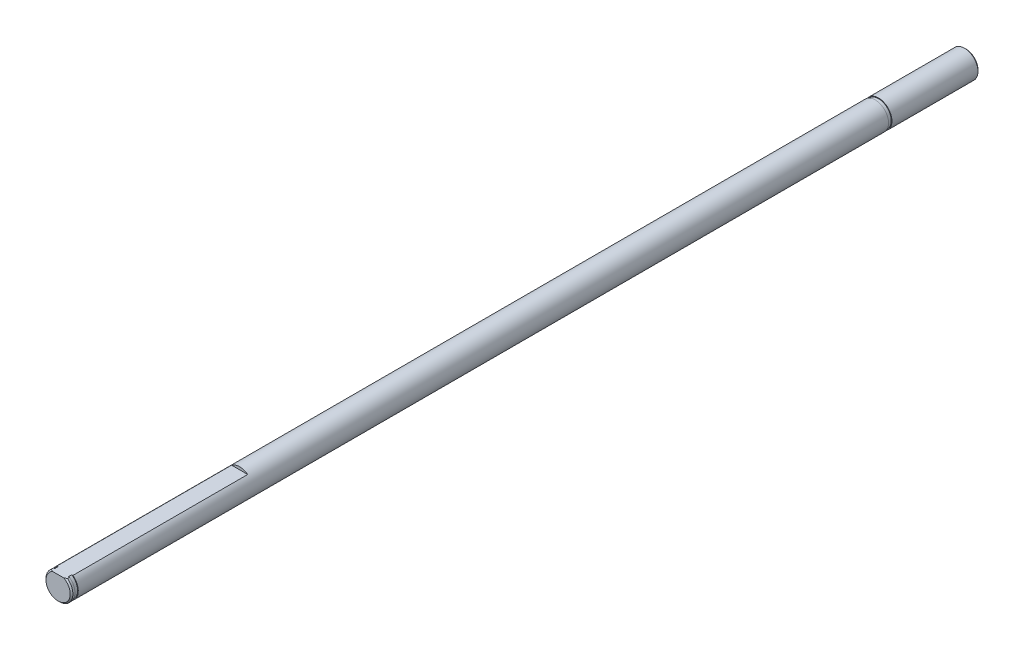
ISO-10303-21;
HEADER;
FILE_DESCRIPTION(('STEP AP214'),'2;1');
FILE_NAME('part.step','',(''),(''),'','','');
FILE_SCHEMA(('AUTOMOTIVE_DESIGN { 1 0 10303 214 1 1 1 1 }'));
ENDSEC;
DATA;
#1=APPLICATION_CONTEXT('core data for automotive mechanical design processes');
#2=APPLICATION_PROTOCOL_DEFINITION('international standard','automotive_design',2000,#1);
#3=PRODUCT_CONTEXT('',#1,'mechanical');
#4=PRODUCT('Part','Part','',(#3));
#5=PRODUCT_RELATED_PRODUCT_CATEGORY('part','',(#4));
#6=PRODUCT_DEFINITION_FORMATION('','',#4);
#7=PRODUCT_DEFINITION_CONTEXT('part definition',#1,'design');
#8=PRODUCT_DEFINITION('design','',#6,#7);
#9=PRODUCT_DEFINITION_SHAPE('','',#8);
#10=(LENGTH_UNIT() NAMED_UNIT(*) SI_UNIT(.MILLI.,.METRE.));
#11=(NAMED_UNIT(*) PLANE_ANGLE_UNIT() SI_UNIT($,.RADIAN.));
#12=(NAMED_UNIT(*) SI_UNIT($,.STERADIAN.) SOLID_ANGLE_UNIT());
#13=UNCERTAINTY_MEASURE_WITH_UNIT(LENGTH_MEASURE(1.E-05),#10,'distance_accuracy_value','');
#14=(GEOMETRIC_REPRESENTATION_CONTEXT(3) GLOBAL_UNCERTAINTY_ASSIGNED_CONTEXT((#13)) GLOBAL_UNIT_ASSIGNED_CONTEXT((#10,
#11,#12)) REPRESENTATION_CONTEXT('',''));
#15=CARTESIAN_POINT('',(0.,0.,0.));
#16=DIRECTION('',(0.,0.,1.));
#17=DIRECTION('',(1.,0.,0.));
#18=AXIS2_PLACEMENT_3D('',#15,#16,#17);
#19=CARTESIAN_POINT('',(0.,0.,67.5));
#20=DIRECTION('',(0.,0.,-1.));
#21=DIRECTION('',(-1.,0.,0.));
#22=AXIS2_PLACEMENT_3D('',#19,#20,#21);
#23=CYLINDRICAL_SURFACE('',#22,2.);
#24=DIRECTION('',(0.,0.,1.));
#25=VECTOR('',#24,1.);
#26=CARTESIAN_POINT('',(1.2,1.6,40.5));
#27=LINE('',#26,#25);
#28=CARTESIAN_POINT('',(1.2,1.6,67.));
#29=VERTEX_POINT('',#28);
#30=CARTESIAN_POINT('',(1.2,1.6,67.3));
#31=VERTEX_POINT('',#30);
#32=EDGE_CURVE('E122',#29,#31,#27,.T.);
#33=ORIENTED_EDGE('',*,*,#32,.T.);
#34=CARTESIAN_POINT('',(0.,0.,67.3));
#35=DIRECTION('',(0.,0.,1.));
#36=DIRECTION('',(1.,0.,0.));
#37=AXIS2_PLACEMENT_3D('',#34,#35,#36);
#38=CIRCLE('',#37,2.);
#39=CARTESIAN_POINT('',(-1.2,1.6,67.3));
#40=VERTEX_POINT('',#39);
#41=EDGE_CURVE('E11',#31,#40,#38,.F.);
#42=ORIENTED_EDGE('',*,*,#41,.T.);
#43=DIRECTION('',(0.,0.,1.));
#44=VECTOR('',#43,1.);
#45=CARTESIAN_POINT('',(-1.2,1.6,40.5));
#46=LINE('',#45,#44);
#47=CARTESIAN_POINT('',(-1.2,1.6,67.));
#48=VERTEX_POINT('',#47);
#49=EDGE_CURVE('E115',#48,#40,#46,.T.);
#50=ORIENTED_EDGE('',*,*,#49,.F.);
#51=CARTESIAN_POINT('',(0.,0.,67.));
#52=DIRECTION('',(0.,0.,-1.));
#53=DIRECTION('',(0.,1.,0.));
#54=AXIS2_PLACEMENT_3D('',#51,#52,#53);
#55=CIRCLE('',#54,2.);
#56=EDGE_CURVE('E148',#29,#48,#55,.T.);
#57=ORIENTED_EDGE('',*,*,#56,.F.);
#58=EDGE_LOOP('',(#33,#42,#50,#57));
#59=FACE_BOUND('',#58,.T.);
#60=ADVANCED_FACE('F43',(#59),#23,.T.);
#61=CARTESIAN_POINT('',(0.,0.,67.5));
#62=DIRECTION('',(0.,0.,1.));
#63=DIRECTION('',(1.,0.,0.));
#64=AXIS2_PLACEMENT_3D('',#61,#62,#63);
#65=PLANE('',#64);
#66=DIRECTION('',(1.,0.,0.));
#67=VECTOR('',#66,1.);
#68=CARTESIAN_POINT('',(1.2,1.6,67.5));
#69=LINE('',#68,#67);
#70=CARTESIAN_POINT('',(-0.824621125123555,1.6,67.5));
#71=VERTEX_POINT('',#70);
#72=CARTESIAN_POINT('',(0.824621125123555,1.6,67.5));
#73=VERTEX_POINT('',#72);
#74=EDGE_CURVE('E109',#71,#73,#69,.T.);
#75=ORIENTED_EDGE('',*,*,#74,.F.);
#76=CARTESIAN_POINT('',(0.,0.,67.5));
#77=DIRECTION('',(0.,0.,1.));
#78=DIRECTION('',(1.,0.,0.));
#79=AXIS2_PLACEMENT_3D('',#76,#77,#78);
#80=CIRCLE('',#79,1.80000000000001);
#81=EDGE_CURVE('E168',#71,#73,#80,.T.);
#82=ORIENTED_EDGE('',*,*,#81,.T.);
#83=EDGE_LOOP('',(#75,#82));
#84=FACE_BOUND('',#83,.T.);
#85=ADVANCED_FACE('F198',(#84),#65,.T.);
#86=CARTESIAN_POINT('',(0.,2.,67.));
#87=DIRECTION('',(0.,0.,1.));
#88=DIRECTION('',(0.,-1.,0.));
#89=AXIS2_PLACEMENT_3D('',#86,#87,#88);
#90=PLANE('',#89);
#91=ORIENTED_EDGE('',*,*,#56,.T.);
#92=DIRECTION('',(1.,0.,0.));
#93=VECTOR('',#92,1.);
#94=CARTESIAN_POINT('',(0.,1.6,67.));
#95=LINE('',#94,#93);
#96=CARTESIAN_POINT('',(-1.02469507659596,1.6,67.));
#97=VERTEX_POINT('',#96);
#98=EDGE_CURVE('E133',#48,#97,#95,.T.);
#99=ORIENTED_EDGE('',*,*,#98,.T.);
#100=CARTESIAN_POINT('',(0.,0.,67.));
#101=DIRECTION('',(0.,0.,-1.));
#102=DIRECTION('',(0.,1.,0.));
#103=AXIS2_PLACEMENT_3D('',#100,#101,#102);
#104=CIRCLE('',#103,1.9);
#105=CARTESIAN_POINT('',(1.02469507659596,1.6,67.));
#106=VERTEX_POINT('',#105);
#107=EDGE_CURVE('E145',#106,#97,#104,.T.);
#108=ORIENTED_EDGE('',*,*,#107,.F.);
#109=EDGE_CURVE('E136',#106,#29,#95,.T.);
#110=ORIENTED_EDGE('',*,*,#109,.T.);
#111=EDGE_LOOP('',(#91,#99,#108,#110));
#112=FACE_BOUND('',#111,.T.);
#113=ADVANCED_FACE('F194',(#112),#90,.F.);
#114=CARTESIAN_POINT('',(0.,0.,-67.5));
#115=DIRECTION('',(0.,0.,-1.));
#116=DIRECTION('',(0.,1.,0.));
#117=AXIS2_PLACEMENT_3D('',#114,#115,#116);
#118=CYLINDRICAL_SURFACE('',#117,1.9);
#119=ORIENTED_EDGE('',*,*,#107,.T.);
#120=DIRECTION('',(0.,0.,-1.));
#121=VECTOR('',#120,1.);
#122=CARTESIAN_POINT('',(-1.02469507659596,1.6,-67.5));
#123=LINE('',#122,#121);
#124=CARTESIAN_POINT('',(-1.02469507659596,1.6,66.5));
#125=VERTEX_POINT('',#124);
#126=EDGE_CURVE('E129',#97,#125,#123,.T.);
#127=ORIENTED_EDGE('',*,*,#126,.T.);
#128=CARTESIAN_POINT('',(0.,0.,66.5));
#129=DIRECTION('',(0.,0.,-1.));
#130=DIRECTION('',(0.,1.,0.));
#131=AXIS2_PLACEMENT_3D('',#128,#129,#130);
#132=CIRCLE('',#131,1.9);
#133=CARTESIAN_POINT('',(1.02469507659596,1.6,66.5));
#134=VERTEX_POINT('',#133);
#135=EDGE_CURVE('E141',#134,#125,#132,.T.);
#136=ORIENTED_EDGE('',*,*,#135,.F.);
#137=DIRECTION('',(0.,0.,-1.));
#138=VECTOR('',#137,1.);
#139=CARTESIAN_POINT('',(1.02469507659596,1.6,-67.5));
#140=LINE('',#139,#138);
#141=EDGE_CURVE('E137',#134,#106,#140,.F.);
#142=ORIENTED_EDGE('',*,*,#141,.T.);
#143=EDGE_LOOP('',(#119,#127,#136,#142));
#144=FACE_BOUND('',#143,.T.);
#145=ADVANCED_FACE('F190',(#144),#118,.T.);
#146=CARTESIAN_POINT('',(0.,1.9,66.5));
#147=DIRECTION('',(0.,0.,-1.));
#148=DIRECTION('',(0.,1.,0.));
#149=AXIS2_PLACEMENT_3D('',#146,#147,#148);
#150=PLANE('',#149);
#151=CARTESIAN_POINT('',(0.,0.,66.5));
#152=DIRECTION('',(0.,0.,-1.));
#153=DIRECTION('',(0.,1.,0.));
#154=AXIS2_PLACEMENT_3D('',#151,#152,#153);
#155=CIRCLE('',#154,2.);
#156=CARTESIAN_POINT('',(1.2,1.6,66.5));
#157=VERTEX_POINT('',#156);
#158=CARTESIAN_POINT('',(-1.2,1.6,66.5));
#159=VERTEX_POINT('',#158);
#160=EDGE_CURVE('E121',#157,#159,#155,.T.);
#161=ORIENTED_EDGE('',*,*,#160,.F.);
#162=DIRECTION('',(-1.,0.,0.));
#163=VECTOR('',#162,1.);
#164=CARTESIAN_POINT('',(0.,1.6,66.5));
#165=LINE('',#164,#163);
#166=EDGE_CURVE('E130',#157,#134,#165,.T.);
#167=ORIENTED_EDGE('',*,*,#166,.T.);
#168=ORIENTED_EDGE('',*,*,#135,.T.);
#169=EDGE_CURVE('E127',#125,#159,#165,.T.);
#170=ORIENTED_EDGE('',*,*,#169,.T.);
#171=EDGE_LOOP('',(#161,#167,#168,#170));
#172=FACE_BOUND('',#171,.T.);
#173=ADVANCED_FACE('F186',(#172),#150,.F.);
#174=ORIENTED_EDGE('',*,*,#160,.T.);
#175=CARTESIAN_POINT('',(-1.2,1.6,40.5));
#176=VERTEX_POINT('',#175);
#177=EDGE_CURVE('E112',#176,#159,#46,.T.);
#178=ORIENTED_EDGE('',*,*,#177,.F.);
#179=CARTESIAN_POINT('',(0.,0.,40.5));
#180=DIRECTION('',(0.,0.,1.));
#181=DIRECTION('',(1.,0.,0.));
#182=AXIS2_PLACEMENT_3D('',#179,#180,#181);
#183=CIRCLE('',#182,2.);
#184=CARTESIAN_POINT('',(1.2,1.6,40.5));
#185=VERTEX_POINT('',#184);
#186=EDGE_CURVE('E101',#185,#176,#183,.T.);
#187=ORIENTED_EDGE('',*,*,#186,.F.);
#188=EDGE_CURVE('E114',#185,#157,#27,.T.);
#189=ORIENTED_EDGE('',*,*,#188,.T.);
#190=EDGE_LOOP('',(#174,#178,#187,#189));
#191=FACE_BOUND('',#190,.T.);
#192=CARTESIAN_POINT('',(0.,0.,-54.));
#193=DIRECTION('',(0.,0.,-1.));
#194=DIRECTION('',(0.,1.,0.));
#195=AXIS2_PLACEMENT_3D('',#192,#193,#194);
#196=CIRCLE('',#195,2.);
#197=CARTESIAN_POINT('',(0.,2.,-54.));
#198=VERTEX_POINT('',#197);
#199=EDGE_CURVE('E152',#198,#198,#196,.T.);
#200=ORIENTED_EDGE('',*,*,#199,.F.);
#201=EDGE_LOOP('',(#200));
#202=FACE_BOUND('',#201,.T.);
#203=ADVANCED_FACE('F118',(#191,#202),#23,.T.);
#204=CARTESIAN_POINT('',(0.,2.,-54.5));
#205=DIRECTION('',(0.,0.,-1.));
#206=DIRECTION('',(0.,1.,0.));
#207=AXIS2_PLACEMENT_3D('',#204,#205,#206);
#208=PLANE('',#207);
#209=CARTESIAN_POINT('',(0.,0.,-54.5));
#210=DIRECTION('',(0.,0.,-1.));
#211=DIRECTION('',(0.,1.,0.));
#212=AXIS2_PLACEMENT_3D('',#209,#210,#211);
#213=CIRCLE('',#212,2.);
#214=CARTESIAN_POINT('',(0.,2.,-54.5));
#215=VERTEX_POINT('',#214);
#216=EDGE_CURVE('E142',#215,#215,#213,.T.);
#217=ORIENTED_EDGE('',*,*,#216,.F.);
#218=EDGE_LOOP('',(#217));
#219=FACE_BOUND('',#218,.T.);
#220=CARTESIAN_POINT('',(0.,0.,-54.5));
#221=DIRECTION('',(0.,0.,-1.));
#222=DIRECTION('',(0.,1.,0.));
#223=AXIS2_PLACEMENT_3D('',#220,#221,#222);
#224=CIRCLE('',#223,1.9);
#225=CARTESIAN_POINT('',(0.,1.9,-54.5));
#226=VERTEX_POINT('',#225);
#227=EDGE_CURVE('E158',#226,#226,#224,.T.);
#228=ORIENTED_EDGE('',*,*,#227,.T.);
#229=EDGE_LOOP('',(#228));
#230=FACE_BOUND('',#229,.T.);
#231=ADVANCED_FACE('F208',(#219,#230),#208,.F.);
#232=CARTESIAN_POINT('',(0.,0.,-67.5));
#233=DIRECTION('',(0.,0.,-1.));
#234=DIRECTION('',(0.,1.,0.));
#235=AXIS2_PLACEMENT_3D('',#232,#233,#234);
#236=CYLINDRICAL_SURFACE('',#235,1.9);
#237=ORIENTED_EDGE('',*,*,#227,.F.);
#238=EDGE_LOOP('',(#237));
#239=FACE_BOUND('',#238,.T.);
#240=CARTESIAN_POINT('',(0.,0.,-54.));
#241=DIRECTION('',(0.,0.,-1.));
#242=DIRECTION('',(0.,1.,0.));
#243=AXIS2_PLACEMENT_3D('',#240,#241,#242);
#244=CIRCLE('',#243,1.9);
#245=CARTESIAN_POINT('',(0.,1.9,-54.));
#246=VERTEX_POINT('',#245);
#247=EDGE_CURVE('E155',#246,#246,#244,.T.);
#248=ORIENTED_EDGE('',*,*,#247,.T.);
#249=EDGE_LOOP('',(#248));
#250=FACE_BOUND('',#249,.T.);
#251=ADVANCED_FACE('F204',(#239,#250),#236,.T.);
#252=CARTESIAN_POINT('',(0.,1.9,-54.));
#253=DIRECTION('',(0.,0.,1.));
#254=DIRECTION('',(0.,-1.,0.));
#255=AXIS2_PLACEMENT_3D('',#252,#253,#254);
#256=PLANE('',#255);
#257=ORIENTED_EDGE('',*,*,#247,.F.);
#258=EDGE_LOOP('',(#257));
#259=FACE_BOUND('',#258,.T.);
#260=ORIENTED_EDGE('',*,*,#199,.T.);
#261=EDGE_LOOP('',(#260));
#262=FACE_BOUND('',#261,.T.);
#263=ADVANCED_FACE('F200',(#259,#262),#256,.F.);
#264=CARTESIAN_POINT('',(0.,0.,-67.5));
#265=DIRECTION('',(0.,0.,1.));
#266=DIRECTION('',(1.,0.,0.));
#267=AXIS2_PLACEMENT_3D('',#264,#265,#266);
#268=PLANE('',#267);
#269=CARTESIAN_POINT('',(0.,0.,-67.5));
#270=DIRECTION('',(0.,0.,1.));
#271=DIRECTION('',(1.,0.,0.));
#272=AXIS2_PLACEMENT_3D('',#269,#270,#271);
#273=CIRCLE('',#272,1.8);
#274=CARTESIAN_POINT('',(1.8,0.,-67.5));
#275=VERTEX_POINT('',#274);
#276=EDGE_CURVE('E165',#275,#275,#273,.F.);
#277=ORIENTED_EDGE('',*,*,#276,.T.);
#278=EDGE_LOOP('',(#277));
#279=FACE_BOUND('',#278,.T.);
#280=ADVANCED_FACE('F203',(#279),#268,.F.);
#281=CARTESIAN_POINT('',(0.,0.,-67.3));
#282=DIRECTION('',(0.,0.,1.));
#283=DIRECTION('',(1.,0.,0.));
#284=AXIS2_PLACEMENT_3D('',#281,#282,#283);
#285=CIRCLE('',#284,2.);
#286=CARTESIAN_POINT('',(2.,0.,-67.3));
#287=VERTEX_POINT('',#286);
#288=EDGE_CURVE('E151',#287,#287,#285,.T.);
#289=ORIENTED_EDGE('',*,*,#288,.T.);
#290=EDGE_LOOP('',(#289));
#291=FACE_BOUND('',#290,.T.);
#292=ORIENTED_EDGE('',*,*,#216,.T.);
#293=EDGE_LOOP('',(#292));
#294=FACE_BOUND('',#293,.T.);
#295=ADVANCED_FACE('F185',(#291,#294),#23,.T.);
#296=CARTESIAN_POINT('',(1.2,1.6,40.5));
#297=DIRECTION('',(0.,-1.,0.));
#298=DIRECTION('',(0.,0.,-1.));
#299=AXIS2_PLACEMENT_3D('',#296,#297,#298);
#300=PLANE('',#299);
#301=ORIENTED_EDGE('',*,*,#74,.T.);
#302=CARTESIAN_POINT('',(0.824621125123555,1.6,67.5));
#303=CARTESIAN_POINT('',(0.856877293257508,1.6,67.4852198794074));
#304=CARTESIAN_POINT('',(0.888872057054339,1.6,67.4698801007305));
#305=CARTESIAN_POINT('',(0.952345944780462,1.6,67.4382255706314));
#306=CARTESIAN_POINT('',(0.983825442744142,1.6,67.421911570392));
#307=CARTESIAN_POINT('',(1.04632101968992,1.6,67.3884321577402));
#308=CARTESIAN_POINT('',(1.07733715701408,1.6,67.371266853712));
#309=CARTESIAN_POINT('',(1.1389676849875,1.6,67.3361752294232));
#310=CARTESIAN_POINT('',(1.16958175176393,1.6,67.318248339673));
#311=CARTESIAN_POINT('',(1.2,1.6,67.3));
#312=B_SPLINE_CURVE_WITH_KNOTS('',3,(#302,#303,#304,#305,#306,#307,#308,#309,#310,#311),
.UNSPECIFIED.,.F.,.F.,(4,2,2,2,4),(0.,0.10643161411238,0.212782197002136,0.319119274399979,
0.425537317307232),.UNSPECIFIED.);
#313=EDGE_CURVE('E53',#73,#31,#312,.T.);
#314=ORIENTED_EDGE('',*,*,#313,.T.);
#315=ORIENTED_EDGE('',*,*,#32,.F.);
#316=ORIENTED_EDGE('',*,*,#109,.F.);
#317=ORIENTED_EDGE('',*,*,#141,.F.);
#318=ORIENTED_EDGE('',*,*,#166,.F.);
#319=ORIENTED_EDGE('',*,*,#188,.F.);
#320=DIRECTION('',(1.,0.,0.));
#321=VECTOR('',#320,1.);
#322=CARTESIAN_POINT('',(1.2,1.6,40.5));
#323=LINE('',#322,#321);
#324=EDGE_CURVE('E104',#176,#185,#323,.T.);
#325=ORIENTED_EDGE('',*,*,#324,.F.);
#326=ORIENTED_EDGE('',*,*,#177,.T.);
#327=ORIENTED_EDGE('',*,*,#169,.F.);
#328=ORIENTED_EDGE('',*,*,#126,.F.);
#329=ORIENTED_EDGE('',*,*,#98,.F.);
#330=ORIENTED_EDGE('',*,*,#49,.T.);
#331=CARTESIAN_POINT('',(-1.2,1.6,67.3));
#332=CARTESIAN_POINT('',(-1.16958175176393,1.6,67.318248339673));
#333=CARTESIAN_POINT('',(-1.1389676849875,1.6,67.3361752294232));
#334=CARTESIAN_POINT('',(-1.07733715701408,1.6,67.371266853712));
#335=CARTESIAN_POINT('',(-1.04632101968992,1.6,67.3884321577402));
#336=CARTESIAN_POINT('',(-0.983825442744142,1.6,67.421911570392));
#337=CARTESIAN_POINT('',(-0.952345944780462,1.6,67.4382255706314));
#338=CARTESIAN_POINT('',(-0.888872057054339,1.6,67.4698801007305));
#339=CARTESIAN_POINT('',(-0.856877293257507,1.6,67.4852198794074));
#340=CARTESIAN_POINT('',(-0.824621125123554,1.6,67.5));
#341=B_SPLINE_CURVE_WITH_KNOTS('',3,(#331,#332,#333,#334,#335,#336,#337,#338,#339,#340),
.UNSPECIFIED.,.F.,.F.,(4,2,2,2,4),(0.,0.106418042907253,0.212755120305097,0.319105703194853,
0.425537317307234),.UNSPECIFIED.);
#342=EDGE_CURVE('E171',#40,#71,#341,.T.);
#343=ORIENTED_EDGE('',*,*,#342,.T.);
#344=EDGE_LOOP('',(#301,#314,#315,#316,#317,#318,#319,#325,#326,#327,#328,#329,#330,#343));
#345=FACE_BOUND('',#344,.T.);
#346=ADVANCED_FACE('F111',(#345),#300,.F.);
#347=CARTESIAN_POINT('',(0.,0.,40.5));
#348=DIRECTION('',(0.,0.,1.));
#349=DIRECTION('',(1.,0.,0.));
#350=AXIS2_PLACEMENT_3D('',#347,#348,#349);
#351=PLANE('',#350);
#352=ORIENTED_EDGE('',*,*,#186,.T.);
#353=ORIENTED_EDGE('',*,*,#324,.T.);
#354=EDGE_LOOP('',(#352,#353));
#355=FACE_BOUND('',#354,.T.);
#356=ADVANCED_FACE('F103',(#355),#351,.T.);
#357=CARTESIAN_POINT('',(0.,0.,-67.3));
#358=DIRECTION('',(0.,0.,1.));
#359=DIRECTION('',(1.,0.,0.));
#360=AXIS2_PLACEMENT_3D('',#357,#358,#359);
#361=CONICAL_SURFACE('',#360,2.,0.785398163397443);
#362=ORIENTED_EDGE('',*,*,#276,.F.);
#363=EDGE_LOOP('',(#362));
#364=FACE_BOUND('',#363,.T.);
#365=ORIENTED_EDGE('',*,*,#288,.F.);
#366=EDGE_LOOP('',(#365));
#367=FACE_BOUND('',#366,.T.);
#368=ADVANCED_FACE('F221',(#364,#367),#361,.T.);
#369=CARTESIAN_POINT('',(0.,0.,67.5));
#370=DIRECTION('',(0.,0.,-1.));
#371=DIRECTION('',(-1.,0.,0.));
#372=AXIS2_PLACEMENT_3D('',#369,#370,#371);
#373=CONICAL_SURFACE('',#372,1.80000000000001,0.785398163397443);
#374=ORIENTED_EDGE('',*,*,#342,.F.);
#375=ORIENTED_EDGE('',*,*,#41,.F.);
#376=ORIENTED_EDGE('',*,*,#313,.F.);
#377=ORIENTED_EDGE('',*,*,#81,.F.);
#378=EDGE_LOOP('',(#374,#375,#376,#377));
#379=FACE_BOUND('',#378,.T.);
#380=ADVANCED_FACE('F46',(#379),#373,.T.);
#381=CLOSED_SHELL('',(#60,#85,#113,#145,#173,#203,#231,#251,#263,#280,#295,#346,#356,#368,#380));
#382=MANIFOLD_SOLID_BREP('B2',#381);
#383=ADVANCED_BREP_SHAPE_REPRESENTATION('',(#18,#382),#14);
#384=SHAPE_DEFINITION_REPRESENTATION(#9,#383);
ENDSEC;
END-ISO-10303-21;
